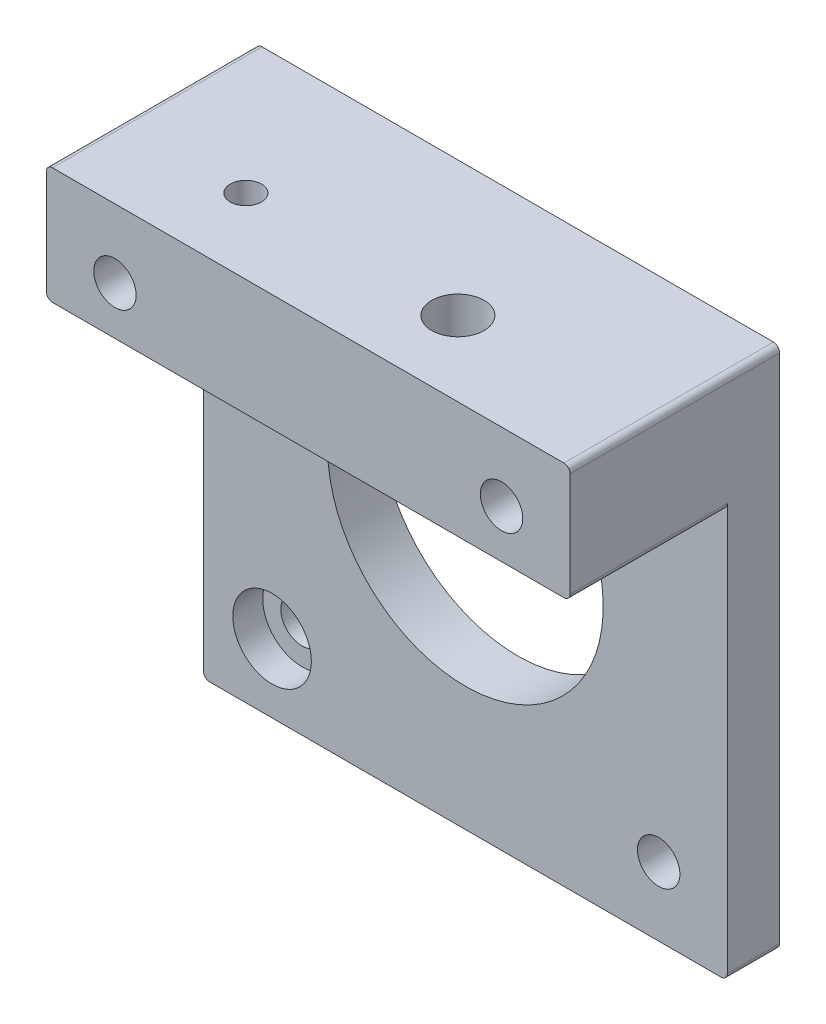
ISO-10303-21;
HEADER;
FILE_DESCRIPTION(('STEP AP214'),'2;1');
FILE_NAME('part.step','',(''),(''),'','','');
FILE_SCHEMA(('AUTOMOTIVE_DESIGN { 1 0 10303 214 1 1 1 1 }'));
ENDSEC;
DATA;
#1=APPLICATION_CONTEXT('core data for automotive mechanical design processes');
#2=APPLICATION_PROTOCOL_DEFINITION('international standard','automotive_design',2000,#1);
#3=PRODUCT_CONTEXT('',#1,'mechanical');
#4=PRODUCT('Part','Part','',(#3));
#5=PRODUCT_RELATED_PRODUCT_CATEGORY('part','',(#4));
#6=PRODUCT_DEFINITION_FORMATION('','',#4);
#7=PRODUCT_DEFINITION_CONTEXT('part definition',#1,'design');
#8=PRODUCT_DEFINITION('design','',#6,#7);
#9=PRODUCT_DEFINITION_SHAPE('','',#8);
#10=(LENGTH_UNIT() NAMED_UNIT(*) SI_UNIT(.MILLI.,.METRE.));
#11=(NAMED_UNIT(*) PLANE_ANGLE_UNIT() SI_UNIT($,.RADIAN.));
#12=(NAMED_UNIT(*) SI_UNIT($,.STERADIAN.) SOLID_ANGLE_UNIT());
#13=UNCERTAINTY_MEASURE_WITH_UNIT(LENGTH_MEASURE(1.E-05),#10,'distance_accuracy_value','');
#14=(GEOMETRIC_REPRESENTATION_CONTEXT(3) GLOBAL_UNCERTAINTY_ASSIGNED_CONTEXT((#13)) GLOBAL_UNIT_ASSIGNED_CONTEXT((#10,
#11,#12)) REPRESENTATION_CONTEXT('',''));
#15=CARTESIAN_POINT('',(0.,0.,0.));
#16=DIRECTION('',(0.,0.,1.));
#17=DIRECTION('',(1.,0.,0.));
#18=AXIS2_PLACEMENT_3D('',#15,#16,#17);
#19=CARTESIAN_POINT('',(-21.,21.,16.8));
#20=DIRECTION('',(0.,-1.,0.));
#21=DIRECTION('',(0.,0.,-1.));
#22=AXIS2_PLACEMENT_3D('',#19,#20,#21);
#23=PLANE('',#22);
#24=CARTESIAN_POINT('',(6.,21.,10.8));
#25=DIRECTION('',(0.,1.,0.));
#26=DIRECTION('',(0.,0.,1.));
#27=AXIS2_PLACEMENT_3D('',#24,#25,#26);
#28=CIRCLE('',#27,2.1);
#29=CARTESIAN_POINT('',(6.,21.,12.9));
#30=VERTEX_POINT('',#29);
#31=EDGE_CURVE('E531',#30,#30,#28,.T.);
#32=ORIENTED_EDGE('',*,*,#31,.F.);
#33=EDGE_LOOP('',(#32));
#34=FACE_BOUND('',#33,.T.);
#35=DIRECTION('',(-1.,0.,0.));
#36=VECTOR('',#35,1.);
#37=CARTESIAN_POINT('',(-21.,21.,16.8));
#38=LINE('',#37,#36);
#39=CARTESIAN_POINT('',(20.5,21.,16.8));
#40=VERTEX_POINT('',#39);
#41=CARTESIAN_POINT('',(-20.5,21.,16.8));
#42=VERTEX_POINT('',#41);
#43=EDGE_CURVE('E255',#40,#42,#38,.T.);
#44=ORIENTED_EDGE('',*,*,#43,.F.);
#45=DIRECTION('',(0.,0.,-1.));
#46=VECTOR('',#45,1.);
#47=CARTESIAN_POINT('',(20.5,21.,16.8));
#48=LINE('',#47,#46);
#49=CARTESIAN_POINT('',(20.5,21.,0.));
#50=VERTEX_POINT('',#49);
#51=EDGE_CURVE('E180',#40,#50,#48,.T.);
#52=ORIENTED_EDGE('',*,*,#51,.T.);
#53=DIRECTION('',(-1.,0.,0.));
#54=VECTOR('',#53,1.);
#55=CARTESIAN_POINT('',(-21.,21.,0.));
#56=LINE('',#55,#54);
#57=CARTESIAN_POINT('',(-20.5,21.,0.));
#58=VERTEX_POINT('',#57);
#59=EDGE_CURVE('E261',#50,#58,#56,.T.);
#60=ORIENTED_EDGE('',*,*,#59,.T.);
#61=DIRECTION('',(0.,0.,-1.));
#62=VECTOR('',#61,1.);
#63=CARTESIAN_POINT('',(-20.5,21.,16.8));
#64=LINE('',#63,#62);
#65=EDGE_CURVE('E178',#58,#42,#64,.F.);
#66=ORIENTED_EDGE('',*,*,#65,.T.);
#67=EDGE_LOOP('',(#44,#52,#60,#66));
#68=FACE_BOUND('',#67,.T.);
#69=CARTESIAN_POINT('',(-11.,21.,10.8));
#70=DIRECTION('',(0.,1.,0.));
#71=DIRECTION('',(0.,0.,1.));
#72=AXIS2_PLACEMENT_3D('',#69,#70,#71);
#73=CIRCLE('',#72,1.25);
#74=CARTESIAN_POINT('',(-11.,21.,12.05));
#75=VERTEX_POINT('',#74);
#76=EDGE_CURVE('E534',#75,#75,#73,.T.);
#77=ORIENTED_EDGE('',*,*,#76,.F.);
#78=EDGE_LOOP('',(#77));
#79=FACE_BOUND('',#78,.T.);
#80=ADVANCED_FACE('F34',(#34,#68,#79),#23,.F.);
#81=CARTESIAN_POINT('',(-15.5,-15.5,16.8));
#82=DIRECTION('',(0.,0.,1.));
#83=DIRECTION('',(1.,0.,0.));
#84=AXIS2_PLACEMENT_3D('',#81,#82,#83);
#85=CYLINDRICAL_SURFACE('',#84,1.7);
#86=CARTESIAN_POINT('',(-15.5,-15.5,0.));
#87=DIRECTION('',(0.,0.,1.));
#88=DIRECTION('',(1.,0.,0.));
#89=AXIS2_PLACEMENT_3D('',#86,#87,#88);
#90=CIRCLE('',#89,1.7);
#91=CARTESIAN_POINT('',(-13.8,-15.5,0.));
#92=VERTEX_POINT('',#91);
#93=EDGE_CURVE('E295',#92,#92,#90,.T.);
#94=ORIENTED_EDGE('',*,*,#93,.F.);
#95=EDGE_LOOP('',(#94));
#96=FACE_BOUND('',#95,.T.);
#97=CARTESIAN_POINT('',(-15.5,-15.5,1.8));
#98=DIRECTION('',(0.,0.,1.));
#99=DIRECTION('',(1.,0.,0.));
#100=AXIS2_PLACEMENT_3D('',#97,#98,#99);
#101=CIRCLE('',#100,1.7);
#102=CARTESIAN_POINT('',(-13.8,-15.5,1.8));
#103=VERTEX_POINT('',#102);
#104=EDGE_CURVE('E267',#103,#103,#101,.F.);
#105=ORIENTED_EDGE('',*,*,#104,.F.);
#106=EDGE_LOOP('',(#105));
#107=FACE_BOUND('',#106,.T.);
#108=ADVANCED_FACE('F217',(#96,#107),#85,.F.);
#109=CARTESIAN_POINT('',(21.,21.,16.8));
#110=DIRECTION('',(-1.,0.,0.));
#111=DIRECTION('',(0.,-1.,0.));
#112=AXIS2_PLACEMENT_3D('',#109,#110,#111);
#113=PLANE('',#112);
#114=DIRECTION('',(0.,1.,0.));
#115=VECTOR('',#114,1.);
#116=CARTESIAN_POINT('',(21.,-21.,4.2));
#117=LINE('',#116,#115);
#118=CARTESIAN_POINT('',(21.,-20.5,4.2));
#119=VERTEX_POINT('',#118);
#120=CARTESIAN_POINT('',(21.,12.15,4.2));
#121=VERTEX_POINT('',#120);
#122=EDGE_CURVE('E146',#119,#121,#117,.T.);
#123=ORIENTED_EDGE('',*,*,#122,.F.);
#124=DIRECTION('',(0.,0.,-1.));
#125=VECTOR('',#124,1.);
#126=CARTESIAN_POINT('',(21.,-20.5,16.8));
#127=LINE('',#126,#125);
#128=CARTESIAN_POINT('',(21.,-20.5,0.));
#129=VERTEX_POINT('',#128);
#130=EDGE_CURVE('E175',#119,#129,#127,.T.);
#131=ORIENTED_EDGE('',*,*,#130,.T.);
#132=DIRECTION('',(0.,1.,0.));
#133=VECTOR('',#132,1.);
#134=CARTESIAN_POINT('',(21.,21.,0.));
#135=LINE('',#134,#133);
#136=CARTESIAN_POINT('',(21.,20.5,0.));
#137=VERTEX_POINT('',#136);
#138=EDGE_CURVE('E201',#129,#137,#135,.T.);
#139=ORIENTED_EDGE('',*,*,#138,.T.);
#140=DIRECTION('',(0.,0.,-1.));
#141=VECTOR('',#140,1.);
#142=CARTESIAN_POINT('',(21.,20.5,16.8));
#143=LINE('',#142,#141);
#144=CARTESIAN_POINT('',(21.,20.5,16.8));
#145=VERTEX_POINT('',#144);
#146=EDGE_CURVE('E173',#137,#145,#143,.F.);
#147=ORIENTED_EDGE('',*,*,#146,.T.);
#148=DIRECTION('',(0.,1.,0.));
#149=VECTOR('',#148,1.);
#150=CARTESIAN_POINT('',(21.,21.,16.8));
#151=LINE('',#150,#149);
#152=CARTESIAN_POINT('',(21.,12.15,16.8));
#153=VERTEX_POINT('',#152);
#154=EDGE_CURVE('E252',#153,#145,#151,.T.);
#155=ORIENTED_EDGE('',*,*,#154,.F.);
#156=DIRECTION('',(0.,0.,1.));
#157=VECTOR('',#156,1.);
#158=CARTESIAN_POINT('',(21.,12.15,16.8));
#159=LINE('',#158,#157);
#160=EDGE_CURVE('E135',#153,#121,#159,.F.);
#161=ORIENTED_EDGE('',*,*,#160,.T.);
#162=EDGE_LOOP('',(#123,#131,#139,#147,#155,#161));
#163=FACE_BOUND('',#162,.T.);
#164=ADVANCED_FACE('F223',(#163),#113,.F.);
#165=CARTESIAN_POINT('',(-21.,21.,16.8));
#166=DIRECTION('',(1.,0.,0.));
#167=DIRECTION('',(0.,0.,-1.));
#168=AXIS2_PLACEMENT_3D('',#165,#166,#167);
#169=PLANE('',#168);
#170=DIRECTION('',(0.,-1.,0.));
#171=VECTOR('',#170,1.);
#172=CARTESIAN_POINT('',(-21.,21.,0.));
#173=LINE('',#172,#171);
#174=CARTESIAN_POINT('',(-21.,20.5,0.));
#175=VERTEX_POINT('',#174);
#176=CARTESIAN_POINT('',(-21.,-20.5,0.));
#177=VERTEX_POINT('',#176);
#178=EDGE_CURVE('E264',#175,#177,#173,.T.);
#179=ORIENTED_EDGE('',*,*,#178,.T.);
#180=DIRECTION('',(0.,0.,-1.));
#181=VECTOR('',#180,1.);
#182=CARTESIAN_POINT('',(-21.,-20.5,16.8));
#183=LINE('',#182,#181);
#184=CARTESIAN_POINT('',(-21.,-20.5,4.2));
#185=VERTEX_POINT('',#184);
#186=EDGE_CURVE('E168',#177,#185,#183,.F.);
#187=ORIENTED_EDGE('',*,*,#186,.T.);
#188=DIRECTION('',(0.,-1.,0.));
#189=VECTOR('',#188,1.);
#190=CARTESIAN_POINT('',(-21.,-21.,4.2));
#191=LINE('',#190,#189);
#192=CARTESIAN_POINT('',(-21.,12.15,4.2));
#193=VERTEX_POINT('',#192);
#194=EDGE_CURVE('E131',#193,#185,#191,.T.);
#195=ORIENTED_EDGE('',*,*,#194,.F.);
#196=DIRECTION('',(0.,0.,1.));
#197=VECTOR('',#196,1.);
#198=CARTESIAN_POINT('',(-21.,12.15,16.8));
#199=LINE('',#198,#197);
#200=CARTESIAN_POINT('',(-21.,12.15,16.8));
#201=VERTEX_POINT('',#200);
#202=EDGE_CURVE('E165',#193,#201,#199,.T.);
#203=ORIENTED_EDGE('',*,*,#202,.T.);
#204=DIRECTION('',(0.,-1.,0.));
#205=VECTOR('',#204,1.);
#206=CARTESIAN_POINT('',(-21.,21.,16.8));
#207=LINE('',#206,#205);
#208=CARTESIAN_POINT('',(-21.,20.5,16.8));
#209=VERTEX_POINT('',#208);
#210=EDGE_CURVE('E154',#209,#201,#207,.T.);
#211=ORIENTED_EDGE('',*,*,#210,.F.);
#212=DIRECTION('',(0.,0.,-1.));
#213=VECTOR('',#212,1.);
#214=CARTESIAN_POINT('',(-21.,20.5,16.8));
#215=LINE('',#214,#213);
#216=EDGE_CURVE('E162',#209,#175,#215,.T.);
#217=ORIENTED_EDGE('',*,*,#216,.T.);
#218=EDGE_LOOP('',(#179,#187,#195,#203,#211,#217));
#219=FACE_BOUND('',#218,.T.);
#220=ADVANCED_FACE('F230',(#219),#169,.F.);
#221=CARTESIAN_POINT('',(-21.,-21.,16.8));
#222=DIRECTION('',(0.,1.,0.));
#223=DIRECTION('',(0.,0.,1.));
#224=AXIS2_PLACEMENT_3D('',#221,#222,#223);
#225=PLANE('',#224);
#226=DIRECTION('',(1.,0.,0.));
#227=VECTOR('',#226,1.);
#228=CARTESIAN_POINT('',(-21.,-21.,4.2));
#229=LINE('',#228,#227);
#230=CARTESIAN_POINT('',(-20.5,-21.,4.2));
#231=VERTEX_POINT('',#230);
#232=CARTESIAN_POINT('',(20.5,-21.,4.2));
#233=VERTEX_POINT('',#232);
#234=EDGE_CURVE('E129',#231,#233,#229,.T.);
#235=ORIENTED_EDGE('',*,*,#234,.F.);
#236=DIRECTION('',(0.,0.,-1.));
#237=VECTOR('',#236,1.);
#238=CARTESIAN_POINT('',(-20.5,-21.,16.8));
#239=LINE('',#238,#237);
#240=CARTESIAN_POINT('',(-20.5,-21.,0.));
#241=VERTEX_POINT('',#240);
#242=EDGE_CURVE('E142',#231,#241,#239,.T.);
#243=ORIENTED_EDGE('',*,*,#242,.T.);
#244=DIRECTION('',(1.,0.,0.));
#245=VECTOR('',#244,1.);
#246=CARTESIAN_POINT('',(-21.,-21.,0.));
#247=LINE('',#246,#245);
#248=CARTESIAN_POINT('',(20.5,-21.,0.));
#249=VERTEX_POINT('',#248);
#250=EDGE_CURVE('E256',#241,#249,#247,.T.);
#251=ORIENTED_EDGE('',*,*,#250,.T.);
#252=DIRECTION('',(0.,0.,-1.));
#253=VECTOR('',#252,1.);
#254=CARTESIAN_POINT('',(20.5,-21.,16.8));
#255=LINE('',#254,#253);
#256=EDGE_CURVE('E145',#249,#233,#255,.F.);
#257=ORIENTED_EDGE('',*,*,#256,.T.);
#258=EDGE_LOOP('',(#235,#243,#251,#257));
#259=FACE_BOUND('',#258,.T.);
#260=ADVANCED_FACE('F140',(#259),#225,.F.);
#261=CARTESIAN_POINT('',(0.,0.,16.8));
#262=DIRECTION('',(0.,0.,1.));
#263=DIRECTION('',(1.,0.,0.));
#264=AXIS2_PLACEMENT_3D('',#261,#262,#263);
#265=PLANE('',#264);
#266=CARTESIAN_POINT('',(15.5,15.5,16.8));
#267=DIRECTION('',(0.,0.,1.));
#268=DIRECTION('',(1.,0.,0.));
#269=AXIS2_PLACEMENT_3D('',#266,#267,#268);
#270=CIRCLE('',#269,1.7);
#271=CARTESIAN_POINT('',(17.2,15.5,16.8));
#272=VERTEX_POINT('',#271);
#273=EDGE_CURVE('E269',#272,#272,#270,.T.);
#274=ORIENTED_EDGE('',*,*,#273,.F.);
#275=EDGE_LOOP('',(#274));
#276=FACE_BOUND('',#275,.T.);
#277=CARTESIAN_POINT('',(-15.5,15.5,16.8));
#278=DIRECTION('',(0.,0.,1.));
#279=DIRECTION('',(1.,0.,0.));
#280=AXIS2_PLACEMENT_3D('',#277,#278,#279);
#281=CIRCLE('',#280,1.7);
#282=CARTESIAN_POINT('',(-13.8,15.5,16.8));
#283=VERTEX_POINT('',#282);
#284=EDGE_CURVE('E289',#283,#283,#281,.T.);
#285=ORIENTED_EDGE('',*,*,#284,.F.);
#286=EDGE_LOOP('',(#285));
#287=FACE_BOUND('',#286,.T.);
#288=ORIENTED_EDGE('',*,*,#154,.T.);
#289=CARTESIAN_POINT('',(20.5,20.5,16.8));
#290=DIRECTION('',(0.,0.,1.));
#291=DIRECTION('',(1.,0.,0.));
#292=AXIS2_PLACEMENT_3D('',#289,#290,#291);
#293=CIRCLE('',#292,0.5);
#294=EDGE_CURVE('E187',#145,#40,#293,.T.);
#295=ORIENTED_EDGE('',*,*,#294,.T.);
#296=ORIENTED_EDGE('',*,*,#43,.T.);
#297=CARTESIAN_POINT('',(-20.5,20.5,16.8));
#298=DIRECTION('',(0.,0.,1.));
#299=DIRECTION('',(1.,0.,0.));
#300=AXIS2_PLACEMENT_3D('',#297,#298,#299);
#301=CIRCLE('',#300,0.5);
#302=EDGE_CURVE('E183',#42,#209,#301,.T.);
#303=ORIENTED_EDGE('',*,*,#302,.T.);
#304=ORIENTED_EDGE('',*,*,#210,.T.);
#305=CARTESIAN_POINT('',(-20.5,12.15,16.8));
#306=DIRECTION('',(0.,0.,1.));
#307=DIRECTION('',(1.,0.,0.));
#308=AXIS2_PLACEMENT_3D('',#305,#306,#307);
#309=CIRCLE('',#308,0.5);
#310=CARTESIAN_POINT('',(-20.5,11.65,16.8));
#311=VERTEX_POINT('',#310);
#312=EDGE_CURVE('E49',#201,#311,#309,.T.);
#313=ORIENTED_EDGE('',*,*,#312,.T.);
#314=DIRECTION('',(-1.,0.,0.));
#315=VECTOR('',#314,1.);
#316=CARTESIAN_POINT('',(-21.,11.65,16.8));
#317=LINE('',#316,#315);
#318=CARTESIAN_POINT('',(20.5,11.65,16.8));
#319=VERTEX_POINT('',#318);
#320=EDGE_CURVE('E249',#319,#311,#317,.T.);
#321=ORIENTED_EDGE('',*,*,#320,.F.);
#322=CARTESIAN_POINT('',(20.5,12.15,16.8));
#323=DIRECTION('',(0.,0.,1.));
#324=DIRECTION('',(1.,0.,0.));
#325=AXIS2_PLACEMENT_3D('',#322,#323,#324);
#326=CIRCLE('',#325,0.5);
#327=EDGE_CURVE('E57',#319,#153,#326,.T.);
#328=ORIENTED_EDGE('',*,*,#327,.T.);
#329=EDGE_LOOP('',(#288,#295,#296,#303,#304,#313,#321,#328));
#330=FACE_BOUND('',#329,.T.);
#331=ADVANCED_FACE('F329',(#276,#287,#330),#265,.T.);
#332=CARTESIAN_POINT('',(0.,0.,0.));
#333=DIRECTION('',(0.,0.,1.));
#334=DIRECTION('',(1.,0.,0.));
#335=AXIS2_PLACEMENT_3D('',#332,#333,#334);
#336=PLANE('',#335);
#337=CARTESIAN_POINT('',(15.5,15.5,0.));
#338=DIRECTION('',(0.,0.,1.));
#339=DIRECTION('',(1.,0.,0.));
#340=AXIS2_PLACEMENT_3D('',#337,#338,#339);
#341=CIRCLE('',#340,1.7);
#342=CARTESIAN_POINT('',(17.2,15.5,0.));
#343=VERTEX_POINT('',#342);
#344=EDGE_CURVE('E274',#343,#343,#341,.T.);
#345=ORIENTED_EDGE('',*,*,#344,.T.);
#346=EDGE_LOOP('',(#345));
#347=FACE_BOUND('',#346,.T.);
#348=CARTESIAN_POINT('',(-15.5,15.5,0.));
#349=DIRECTION('',(0.,0.,1.));
#350=DIRECTION('',(1.,0.,0.));
#351=AXIS2_PLACEMENT_3D('',#348,#349,#350);
#352=CIRCLE('',#351,1.7);
#353=CARTESIAN_POINT('',(-13.8,15.5,0.));
#354=VERTEX_POINT('',#353);
#355=EDGE_CURVE('E292',#354,#354,#352,.T.);
#356=ORIENTED_EDGE('',*,*,#355,.T.);
#357=EDGE_LOOP('',(#356));
#358=FACE_BOUND('',#357,.T.);
#359=ORIENTED_EDGE('',*,*,#93,.T.);
#360=EDGE_LOOP('',(#359));
#361=FACE_BOUND('',#360,.T.);
#362=CARTESIAN_POINT('',(15.5,-15.5,0.));
#363=DIRECTION('',(0.,0.,1.));
#364=DIRECTION('',(1.,0.,0.));
#365=AXIS2_PLACEMENT_3D('',#362,#363,#364);
#366=CIRCLE('',#365,1.7);
#367=CARTESIAN_POINT('',(17.2,-15.5,0.));
#368=VERTEX_POINT('',#367);
#369=EDGE_CURVE('E298',#368,#368,#366,.T.);
#370=ORIENTED_EDGE('',*,*,#369,.T.);
#371=EDGE_LOOP('',(#370));
#372=FACE_BOUND('',#371,.T.);
#373=CARTESIAN_POINT('',(0.,0.,0.));
#374=DIRECTION('',(0.,0.,-1.));
#375=DIRECTION('',(-1.,0.,0.));
#376=AXIS2_PLACEMENT_3D('',#373,#374,#375);
#377=CIRCLE('',#376,11.05);
#378=CARTESIAN_POINT('',(-11.05,0.,0.));
#379=VERTEX_POINT('',#378);
#380=EDGE_CURVE('E304',#379,#379,#377,.T.);
#381=ORIENTED_EDGE('',*,*,#380,.F.);
#382=EDGE_LOOP('',(#381));
#383=FACE_BOUND('',#382,.T.);
#384=ORIENTED_EDGE('',*,*,#250,.F.);
#385=CARTESIAN_POINT('',(-20.5,-20.5,0.));
#386=DIRECTION('',(0.,0.,1.));
#387=DIRECTION('',(1.,0.,0.));
#388=AXIS2_PLACEMENT_3D('',#385,#386,#387);
#389=CIRCLE('',#388,0.5);
#390=EDGE_CURVE('E149',#241,#177,#389,.F.);
#391=ORIENTED_EDGE('',*,*,#390,.T.);
#392=ORIENTED_EDGE('',*,*,#178,.F.);
#393=CARTESIAN_POINT('',(-20.5,20.5,0.));
#394=DIRECTION('',(0.,0.,1.));
#395=DIRECTION('',(1.,0.,0.));
#396=AXIS2_PLACEMENT_3D('',#393,#394,#395);
#397=CIRCLE('',#396,0.5);
#398=EDGE_CURVE('E150',#175,#58,#397,.F.);
#399=ORIENTED_EDGE('',*,*,#398,.T.);
#400=ORIENTED_EDGE('',*,*,#59,.F.);
#401=CARTESIAN_POINT('',(20.5,20.5,0.));
#402=DIRECTION('',(0.,0.,1.));
#403=DIRECTION('',(1.,0.,0.));
#404=AXIS2_PLACEMENT_3D('',#401,#402,#403);
#405=CIRCLE('',#404,0.5);
#406=EDGE_CURVE('E152',#50,#137,#405,.F.);
#407=ORIENTED_EDGE('',*,*,#406,.T.);
#408=ORIENTED_EDGE('',*,*,#138,.F.);
#409=CARTESIAN_POINT('',(20.5,-20.5,0.));
#410=DIRECTION('',(0.,0.,1.));
#411=DIRECTION('',(1.,0.,0.));
#412=AXIS2_PLACEMENT_3D('',#409,#410,#411);
#413=CIRCLE('',#412,0.5);
#414=EDGE_CURVE('E159',#129,#249,#413,.F.);
#415=ORIENTED_EDGE('',*,*,#414,.T.);
#416=EDGE_LOOP('',(#384,#391,#392,#399,#400,#407,#408,#415));
#417=FACE_BOUND('',#416,.T.);
#418=ADVANCED_FACE('F322',(#347,#358,#361,#372,#383,#417),#336,.F.);
#419=CARTESIAN_POINT('',(-21.,11.65,4.2));
#420=DIRECTION('',(0.,1.,0.));
#421=DIRECTION('',(0.,0.,1.));
#422=AXIS2_PLACEMENT_3D('',#419,#420,#421);
#423=PLANE('',#422);
#424=CARTESIAN_POINT('',(-11.,11.65,10.8));
#425=DIRECTION('',(0.,1.,0.));
#426=DIRECTION('',(0.,0.,1.));
#427=AXIS2_PLACEMENT_3D('',#424,#425,#426);
#428=CIRCLE('',#427,1.25);
#429=CARTESIAN_POINT('',(-11.,11.65,12.05));
#430=VERTEX_POINT('',#429);
#431=EDGE_CURVE('E532',#430,#430,#428,.T.);
#432=ORIENTED_EDGE('',*,*,#431,.T.);
#433=EDGE_LOOP('',(#432));
#434=FACE_BOUND('',#433,.T.);
#435=CARTESIAN_POINT('',(6.,11.65,10.8));
#436=DIRECTION('',(0.,1.,0.));
#437=DIRECTION('',(0.,0.,1.));
#438=AXIS2_PLACEMENT_3D('',#435,#436,#437);
#439=CIRCLE('',#438,2.1);
#440=CARTESIAN_POINT('',(6.,11.65,12.9));
#441=VERTEX_POINT('',#440);
#442=EDGE_CURVE('E282',#441,#441,#439,.T.);
#443=ORIENTED_EDGE('',*,*,#442,.T.);
#444=EDGE_LOOP('',(#443));
#445=FACE_BOUND('',#444,.T.);
#446=DIRECTION('',(-1.,0.,0.));
#447=VECTOR('',#446,1.);
#448=CARTESIAN_POINT('',(-21.,11.65,4.2));
#449=LINE('',#448,#447);
#450=CARTESIAN_POINT('',(20.5,11.65,4.2));
#451=VERTEX_POINT('',#450);
#452=CARTESIAN_POINT('',(-20.5,11.65,4.2));
#453=VERTEX_POINT('',#452);
#454=EDGE_CURVE('E195',#451,#453,#449,.T.);
#455=ORIENTED_EDGE('',*,*,#454,.F.);
#456=DIRECTION('',(0.,0.,1.));
#457=VECTOR('',#456,1.);
#458=CARTESIAN_POINT('',(20.5,11.65,4.2));
#459=LINE('',#458,#457);
#460=EDGE_CURVE('E191',#451,#319,#459,.T.);
#461=ORIENTED_EDGE('',*,*,#460,.T.);
#462=ORIENTED_EDGE('',*,*,#320,.T.);
#463=DIRECTION('',(0.,0.,1.));
#464=VECTOR('',#463,1.);
#465=CARTESIAN_POINT('',(-20.5,11.65,4.2));
#466=LINE('',#465,#464);
#467=EDGE_CURVE('E189',#311,#453,#466,.F.);
#468=ORIENTED_EDGE('',*,*,#467,.T.);
#469=EDGE_LOOP('',(#455,#461,#462,#468));
#470=FACE_BOUND('',#469,.T.);
#471=ADVANCED_FACE('F199',(#434,#445,#470),#423,.F.);
#472=CARTESIAN_POINT('',(0.,0.,4.2));
#473=DIRECTION('',(0.,0.,-1.));
#474=DIRECTION('',(-1.,0.,0.));
#475=AXIS2_PLACEMENT_3D('',#472,#473,#474);
#476=PLANE('',#475);
#477=CARTESIAN_POINT('',(-15.5,-15.5,4.2));
#478=DIRECTION('',(0.,0.,1.));
#479=DIRECTION('',(1.,0.,0.));
#480=AXIS2_PLACEMENT_3D('',#477,#478,#479);
#481=CIRCLE('',#480,3.15);
#482=CARTESIAN_POINT('',(-12.35,-15.5,4.2));
#483=VERTEX_POINT('',#482);
#484=EDGE_CURVE('E277',#483,#483,#481,.T.);
#485=ORIENTED_EDGE('',*,*,#484,.F.);
#486=EDGE_LOOP('',(#485));
#487=FACE_BOUND('',#486,.T.);
#488=CARTESIAN_POINT('',(15.5,-15.5,4.2));
#489=DIRECTION('',(0.,0.,-1.));
#490=DIRECTION('',(-1.,0.,0.));
#491=AXIS2_PLACEMENT_3D('',#488,#489,#490);
#492=CIRCLE('',#491,1.7);
#493=CARTESIAN_POINT('',(13.8,-15.5,4.2));
#494=VERTEX_POINT('',#493);
#495=EDGE_CURVE('E301',#494,#494,#492,.T.);
#496=ORIENTED_EDGE('',*,*,#495,.T.);
#497=EDGE_LOOP('',(#496));
#498=FACE_BOUND('',#497,.T.);
#499=CARTESIAN_POINT('',(0.,0.,4.2));
#500=DIRECTION('',(0.,0.,-1.));
#501=DIRECTION('',(-1.,0.,0.));
#502=AXIS2_PLACEMENT_3D('',#499,#500,#501);
#503=CIRCLE('',#502,11.05);
#504=CARTESIAN_POINT('',(-11.05,0.,4.2));
#505=VERTEX_POINT('',#504);
#506=EDGE_CURVE('E251',#505,#505,#503,.F.);
#507=ORIENTED_EDGE('',*,*,#506,.F.);
#508=EDGE_LOOP('',(#507));
#509=FACE_BOUND('',#508,.T.);
#510=ORIENTED_EDGE('',*,*,#194,.T.);
#511=CARTESIAN_POINT('',(-20.5,-20.5,4.2));
#512=DIRECTION('',(0.,0.,-1.));
#513=DIRECTION('',(-1.,0.,0.));
#514=AXIS2_PLACEMENT_3D('',#511,#512,#513);
#515=CIRCLE('',#514,0.5);
#516=EDGE_CURVE('E126',#185,#231,#515,.F.);
#517=ORIENTED_EDGE('',*,*,#516,.T.);
#518=ORIENTED_EDGE('',*,*,#234,.T.);
#519=CARTESIAN_POINT('',(20.5,-20.5,4.2));
#520=DIRECTION('',(0.,0.,-1.));
#521=DIRECTION('',(-1.,0.,0.));
#522=AXIS2_PLACEMENT_3D('',#519,#520,#521);
#523=CIRCLE('',#522,0.5);
#524=EDGE_CURVE('E136',#233,#119,#523,.F.);
#525=ORIENTED_EDGE('',*,*,#524,.T.);
#526=ORIENTED_EDGE('',*,*,#122,.T.);
#527=CARTESIAN_POINT('',(20.5,12.15,4.2));
#528=DIRECTION('',(0.,0.,-1.));
#529=DIRECTION('',(-1.,0.,0.));
#530=AXIS2_PLACEMENT_3D('',#527,#528,#529);
#531=CIRCLE('',#530,0.5);
#532=EDGE_CURVE('E42',#121,#451,#531,.T.);
#533=ORIENTED_EDGE('',*,*,#532,.T.);
#534=ORIENTED_EDGE('',*,*,#454,.T.);
#535=CARTESIAN_POINT('',(-20.5,12.15,4.2));
#536=DIRECTION('',(0.,0.,-1.));
#537=DIRECTION('',(-1.,0.,0.));
#538=AXIS2_PLACEMENT_3D('',#535,#536,#537);
#539=CIRCLE('',#538,0.5);
#540=EDGE_CURVE('E11',#453,#193,#539,.T.);
#541=ORIENTED_EDGE('',*,*,#540,.T.);
#542=EDGE_LOOP('',(#510,#517,#518,#525,#526,#533,#534,#541));
#543=FACE_BOUND('',#542,.T.);
#544=ADVANCED_FACE('F128',(#487,#498,#509,#543),#476,.F.);
#545=CARTESIAN_POINT('',(0.,0.,16.801));
#546=DIRECTION('',(0.,0.,-1.));
#547=DIRECTION('',(-1.,0.,0.));
#548=AXIS2_PLACEMENT_3D('',#545,#546,#547);
#549=CYLINDRICAL_SURFACE('',#548,11.05);
#550=ORIENTED_EDGE('',*,*,#380,.T.);
#551=EDGE_LOOP('',(#550));
#552=FACE_BOUND('',#551,.T.);
#553=ORIENTED_EDGE('',*,*,#506,.T.);
#554=EDGE_LOOP('',(#553));
#555=FACE_BOUND('',#554,.T.);
#556=ADVANCED_FACE('F310',(#552,#555),#549,.F.);
#557=CARTESIAN_POINT('',(15.5,-15.5,16.8));
#558=DIRECTION('',(0.,0.,1.));
#559=DIRECTION('',(1.,0.,0.));
#560=AXIS2_PLACEMENT_3D('',#557,#558,#559);
#561=CYLINDRICAL_SURFACE('',#560,1.7);
#562=ORIENTED_EDGE('',*,*,#369,.F.);
#563=EDGE_LOOP('',(#562));
#564=FACE_BOUND('',#563,.T.);
#565=ORIENTED_EDGE('',*,*,#495,.F.);
#566=EDGE_LOOP('',(#565));
#567=FACE_BOUND('',#566,.T.);
#568=ADVANCED_FACE('F319',(#564,#567),#561,.F.);
#569=CARTESIAN_POINT('',(-15.5,15.5,16.8));
#570=DIRECTION('',(0.,0.,1.));
#571=DIRECTION('',(1.,0.,0.));
#572=AXIS2_PLACEMENT_3D('',#569,#570,#571);
#573=CYLINDRICAL_SURFACE('',#572,1.7);
#574=ORIENTED_EDGE('',*,*,#355,.F.);
#575=EDGE_LOOP('',(#574));
#576=FACE_BOUND('',#575,.T.);
#577=ORIENTED_EDGE('',*,*,#284,.T.);
#578=EDGE_LOOP('',(#577));
#579=FACE_BOUND('',#578,.T.);
#580=ADVANCED_FACE('F480',(#576,#579),#573,.F.);
#581=CARTESIAN_POINT('',(15.5,15.5,16.8));
#582=DIRECTION('',(0.,0.,1.));
#583=DIRECTION('',(1.,0.,0.));
#584=AXIS2_PLACEMENT_3D('',#581,#582,#583);
#585=CYLINDRICAL_SURFACE('',#584,1.7);
#586=ORIENTED_EDGE('',*,*,#344,.F.);
#587=EDGE_LOOP('',(#586));
#588=FACE_BOUND('',#587,.T.);
#589=ORIENTED_EDGE('',*,*,#273,.T.);
#590=EDGE_LOOP('',(#589));
#591=FACE_BOUND('',#590,.T.);
#592=ADVANCED_FACE('F465',(#588,#591),#585,.F.);
#593=CARTESIAN_POINT('',(-15.5,-15.5,1.8));
#594=DIRECTION('',(0.,0.,1.));
#595=DIRECTION('',(1.,0.,0.));
#596=AXIS2_PLACEMENT_3D('',#593,#594,#595);
#597=PLANE('',#596);
#598=CARTESIAN_POINT('',(-15.5,-15.5,1.8));
#599=DIRECTION('',(0.,0.,1.));
#600=DIRECTION('',(1.,0.,0.));
#601=AXIS2_PLACEMENT_3D('',#598,#599,#600);
#602=CIRCLE('',#601,3.15);
#603=CARTESIAN_POINT('',(-12.35,-15.5,1.8));
#604=VERTEX_POINT('',#603);
#605=EDGE_CURVE('E270',#604,#604,#602,.T.);
#606=ORIENTED_EDGE('',*,*,#605,.T.);
#607=EDGE_LOOP('',(#606));
#608=FACE_BOUND('',#607,.T.);
#609=ORIENTED_EDGE('',*,*,#104,.T.);
#610=EDGE_LOOP('',(#609));
#611=FACE_BOUND('',#610,.T.);
#612=ADVANCED_FACE('F455',(#608,#611),#597,.T.);
#613=CARTESIAN_POINT('',(-15.5,-15.5,1.8));
#614=DIRECTION('',(0.,0.,1.));
#615=DIRECTION('',(1.,0.,0.));
#616=AXIS2_PLACEMENT_3D('',#613,#614,#615);
#617=CYLINDRICAL_SURFACE('',#616,3.15);
#618=ORIENTED_EDGE('',*,*,#605,.F.);
#619=EDGE_LOOP('',(#618));
#620=FACE_BOUND('',#619,.T.);
#621=ORIENTED_EDGE('',*,*,#484,.T.);
#622=EDGE_LOOP('',(#621));
#623=FACE_BOUND('',#622,.T.);
#624=ADVANCED_FACE('F445',(#620,#623),#617,.F.);
#625=CARTESIAN_POINT('',(6.,21.,10.8));
#626=DIRECTION('',(0.,1.,0.));
#627=DIRECTION('',(0.,0.,1.));
#628=AXIS2_PLACEMENT_3D('',#625,#626,#627);
#629=CYLINDRICAL_SURFACE('',#628,2.1);
#630=ORIENTED_EDGE('',*,*,#442,.F.);
#631=EDGE_LOOP('',(#630));
#632=FACE_BOUND('',#631,.T.);
#633=ORIENTED_EDGE('',*,*,#31,.T.);
#634=EDGE_LOOP('',(#633));
#635=FACE_BOUND('',#634,.T.);
#636=ADVANCED_FACE('F435',(#632,#635),#629,.F.);
#637=CARTESIAN_POINT('',(-11.,21.,10.8));
#638=DIRECTION('',(0.,1.,0.));
#639=DIRECTION('',(0.,0.,1.));
#640=AXIS2_PLACEMENT_3D('',#637,#638,#639);
#641=CYLINDRICAL_SURFACE('',#640,1.25);
#642=ORIENTED_EDGE('',*,*,#431,.F.);
#643=EDGE_LOOP('',(#642));
#644=FACE_BOUND('',#643,.T.);
#645=ORIENTED_EDGE('',*,*,#76,.T.);
#646=EDGE_LOOP('',(#645));
#647=FACE_BOUND('',#646,.T.);
#648=ADVANCED_FACE('F237',(#644,#647),#641,.F.);
#649=CARTESIAN_POINT('',(-20.5,-20.5,16.8));
#650=DIRECTION('',(0.,0.,-1.));
#651=DIRECTION('',(-1.,0.,0.));
#652=AXIS2_PLACEMENT_3D('',#649,#650,#651);
#653=CYLINDRICAL_SURFACE('',#652,0.5);
#654=ORIENTED_EDGE('',*,*,#516,.F.);
#655=ORIENTED_EDGE('',*,*,#186,.F.);
#656=ORIENTED_EDGE('',*,*,#390,.F.);
#657=ORIENTED_EDGE('',*,*,#242,.F.);
#658=EDGE_LOOP('',(#654,#655,#656,#657));
#659=FACE_BOUND('',#658,.T.);
#660=ADVANCED_FACE('F148',(#659),#653,.T.);
#661=CARTESIAN_POINT('',(20.5,-20.5,16.8));
#662=DIRECTION('',(0.,0.,-1.));
#663=DIRECTION('',(-1.,0.,0.));
#664=AXIS2_PLACEMENT_3D('',#661,#662,#663);
#665=CYLINDRICAL_SURFACE('',#664,0.5);
#666=ORIENTED_EDGE('',*,*,#524,.F.);
#667=ORIENTED_EDGE('',*,*,#256,.F.);
#668=ORIENTED_EDGE('',*,*,#414,.F.);
#669=ORIENTED_EDGE('',*,*,#130,.F.);
#670=EDGE_LOOP('',(#666,#667,#668,#669));
#671=FACE_BOUND('',#670,.T.);
#672=ADVANCED_FACE('F213',(#671),#665,.T.);
#673=CARTESIAN_POINT('',(20.5,20.5,16.8));
#674=DIRECTION('',(0.,0.,-1.));
#675=DIRECTION('',(-1.,0.,0.));
#676=AXIS2_PLACEMENT_3D('',#673,#674,#675);
#677=CYLINDRICAL_SURFACE('',#676,0.5);
#678=ORIENTED_EDGE('',*,*,#294,.F.);
#679=ORIENTED_EDGE('',*,*,#146,.F.);
#680=ORIENTED_EDGE('',*,*,#406,.F.);
#681=ORIENTED_EDGE('',*,*,#51,.F.);
#682=EDGE_LOOP('',(#678,#679,#680,#681));
#683=FACE_BOUND('',#682,.T.);
#684=ADVANCED_FACE('F206',(#683),#677,.T.);
#685=CARTESIAN_POINT('',(20.5,12.15,4.2));
#686=DIRECTION('',(0.,0.,1.));
#687=DIRECTION('',(1.,0.,0.));
#688=AXIS2_PLACEMENT_3D('',#685,#686,#687);
#689=CYLINDRICAL_SURFACE('',#688,0.5);
#690=ORIENTED_EDGE('',*,*,#532,.F.);
#691=ORIENTED_EDGE('',*,*,#160,.F.);
#692=ORIENTED_EDGE('',*,*,#327,.F.);
#693=ORIENTED_EDGE('',*,*,#460,.F.);
#694=EDGE_LOOP('',(#690,#691,#692,#693));
#695=FACE_BOUND('',#694,.T.);
#696=ADVANCED_FACE('F203',(#695),#689,.T.);
#697=CARTESIAN_POINT('',(-20.5,12.15,16.8));
#698=DIRECTION('',(0.,0.,1.));
#699=DIRECTION('',(1.,0.,0.));
#700=AXIS2_PLACEMENT_3D('',#697,#698,#699);
#701=CYLINDRICAL_SURFACE('',#700,0.5);
#702=ORIENTED_EDGE('',*,*,#540,.F.);
#703=ORIENTED_EDGE('',*,*,#467,.F.);
#704=ORIENTED_EDGE('',*,*,#312,.F.);
#705=ORIENTED_EDGE('',*,*,#202,.F.);
#706=EDGE_LOOP('',(#702,#703,#704,#705));
#707=FACE_BOUND('',#706,.T.);
#708=ADVANCED_FACE('F205',(#707),#701,.T.);
#709=CARTESIAN_POINT('',(-20.5,20.5,16.8));
#710=DIRECTION('',(0.,0.,-1.));
#711=DIRECTION('',(-1.,0.,0.));
#712=AXIS2_PLACEMENT_3D('',#709,#710,#711);
#713=CYLINDRICAL_SURFACE('',#712,0.5);
#714=ORIENTED_EDGE('',*,*,#302,.F.);
#715=ORIENTED_EDGE('',*,*,#65,.F.);
#716=ORIENTED_EDGE('',*,*,#398,.F.);
#717=ORIENTED_EDGE('',*,*,#216,.F.);
#718=EDGE_LOOP('',(#714,#715,#716,#717));
#719=FACE_BOUND('',#718,.T.);
#720=ADVANCED_FACE('F36',(#719),#713,.T.);
#721=CLOSED_SHELL('',(#80,#108,#164,#220,#260,#331,#418,#471,#544,#556,#568,#580,#592,#612,#624,
#636,#648,#660,#672,#684,#696,#708,#720));
#722=MANIFOLD_SOLID_BREP('B2',#721);
#723=ADVANCED_BREP_SHAPE_REPRESENTATION('',(#18,#722),#14);
#724=SHAPE_DEFINITION_REPRESENTATION(#9,#723);
ENDSEC;
END-ISO-10303-21;
